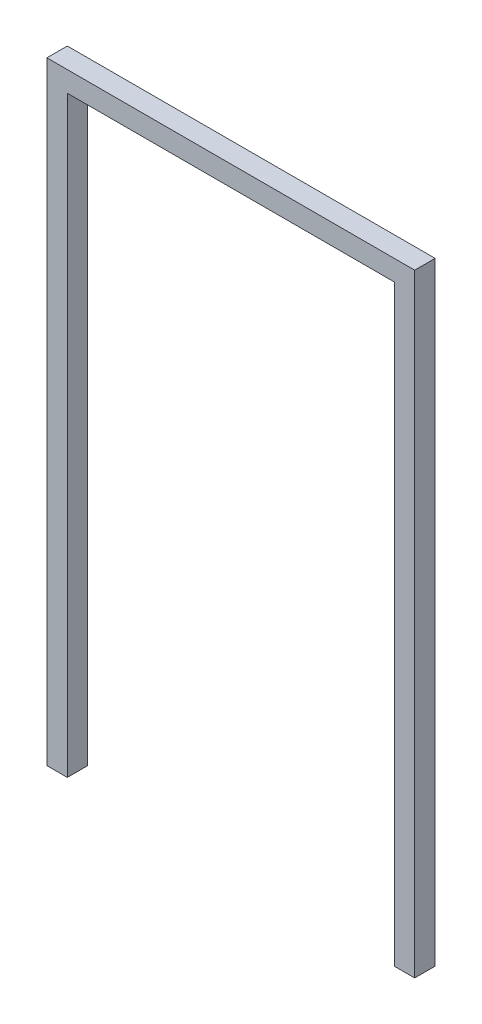
ISO-10303-21;
HEADER;
FILE_DESCRIPTION(('STEP AP214'),'2;1');
FILE_NAME('part.step','',(''),(''),'','','');
FILE_SCHEMA(('AUTOMOTIVE_DESIGN { 1 0 10303 214 1 1 1 1 }'));
ENDSEC;
DATA;
#1=APPLICATION_CONTEXT('core data for automotive mechanical design processes');
#2=APPLICATION_PROTOCOL_DEFINITION('international standard','automotive_design',2000,#1);
#3=PRODUCT_CONTEXT('',#1,'mechanical');
#4=PRODUCT('Part','Part','',(#3));
#5=PRODUCT_RELATED_PRODUCT_CATEGORY('part','',(#4));
#6=PRODUCT_DEFINITION_FORMATION('','',#4);
#7=PRODUCT_DEFINITION_CONTEXT('part definition',#1,'design');
#8=PRODUCT_DEFINITION('design','',#6,#7);
#9=PRODUCT_DEFINITION_SHAPE('','',#8);
#10=(LENGTH_UNIT() NAMED_UNIT(*) SI_UNIT(.MILLI.,.METRE.));
#11=(NAMED_UNIT(*) PLANE_ANGLE_UNIT() SI_UNIT($,.RADIAN.));
#12=(NAMED_UNIT(*) SI_UNIT($,.STERADIAN.) SOLID_ANGLE_UNIT());
#13=UNCERTAINTY_MEASURE_WITH_UNIT(LENGTH_MEASURE(1.E-05),#10,'distance_accuracy_value','');
#14=(GEOMETRIC_REPRESENTATION_CONTEXT(3) GLOBAL_UNCERTAINTY_ASSIGNED_CONTEXT((#13)) GLOBAL_UNIT_ASSIGNED_CONTEXT((#10,
#11,#12)) REPRESENTATION_CONTEXT('',''));
#15=CARTESIAN_POINT('',(0.,0.,0.));
#16=DIRECTION('',(0.,0.,1.));
#17=DIRECTION('',(1.,0.,0.));
#18=AXIS2_PLACEMENT_3D('',#15,#16,#17);
#19=CARTESIAN_POINT('',(-180.,340.,-10.));
#20=DIRECTION('',(-1.,0.,0.));
#21=DIRECTION('',(0.,-1.,0.));
#22=AXIS2_PLACEMENT_3D('',#19,#20,#21);
#23=PLANE('',#22);
#24=DIRECTION('',(0.,-1.,0.));
#25=VECTOR('',#24,1.);
#26=CARTESIAN_POINT('',(-180.,340.,10.));
#27=LINE('',#26,#25);
#28=CARTESIAN_POINT('',(-180.,340.,10.));
#29=VERTEX_POINT('',#28);
#30=CARTESIAN_POINT('',(-180.,-260.,10.));
#31=VERTEX_POINT('',#30);
#32=EDGE_CURVE('E130',#29,#31,#27,.T.);
#33=ORIENTED_EDGE('',*,*,#32,.F.);
#34=DIRECTION('',(0.,0.,1.));
#35=VECTOR('',#34,1.);
#36=CARTESIAN_POINT('',(-180.,340.,-10.));
#37=LINE('',#36,#35);
#38=CARTESIAN_POINT('',(-180.,340.,-10.));
#39=VERTEX_POINT('',#38);
#40=EDGE_CURVE('E11',#39,#29,#37,.T.);
#41=ORIENTED_EDGE('',*,*,#40,.F.);
#42=DIRECTION('',(0.,-1.,0.));
#43=VECTOR('',#42,1.);
#44=CARTESIAN_POINT('',(-180.,340.,-10.));
#45=LINE('',#44,#43);
#46=CARTESIAN_POINT('',(-180.,-260.,-10.));
#47=VERTEX_POINT('',#46);
#48=EDGE_CURVE('E150',#39,#47,#45,.T.);
#49=ORIENTED_EDGE('',*,*,#48,.T.);
#50=DIRECTION('',(0.,0.,1.));
#51=VECTOR('',#50,1.);
#52=CARTESIAN_POINT('',(-180.,-260.,-10.));
#53=LINE('',#52,#51);
#54=EDGE_CURVE('E36',#47,#31,#53,.T.);
#55=ORIENTED_EDGE('',*,*,#54,.T.);
#56=EDGE_LOOP('',(#33,#41,#49,#55));
#57=FACE_BOUND('',#56,.T.);
#58=ADVANCED_FACE('F33',(#57),#23,.T.);
#59=CARTESIAN_POINT('',(-180.,340.,-10.));
#60=DIRECTION('',(0.,1.,0.));
#61=DIRECTION('',(0.,0.,1.));
#62=AXIS2_PLACEMENT_3D('',#59,#60,#61);
#63=PLANE('',#62);
#64=DIRECTION('',(-1.,0.,0.));
#65=VECTOR('',#64,1.);
#66=CARTESIAN_POINT('',(-180.,340.,10.));
#67=LINE('',#66,#65);
#68=CARTESIAN_POINT('',(180.,340.,10.));
#69=VERTEX_POINT('',#68);
#70=EDGE_CURVE('E148',#69,#29,#67,.T.);
#71=ORIENTED_EDGE('',*,*,#70,.F.);
#72=DIRECTION('',(0.,0.,1.));
#73=VECTOR('',#72,1.);
#74=CARTESIAN_POINT('',(180.,340.,-10.));
#75=LINE('',#74,#73);
#76=CARTESIAN_POINT('',(180.,340.,-10.));
#77=VERTEX_POINT('',#76);
#78=EDGE_CURVE('E42',#77,#69,#75,.T.);
#79=ORIENTED_EDGE('',*,*,#78,.F.);
#80=DIRECTION('',(-1.,0.,0.));
#81=VECTOR('',#80,1.);
#82=CARTESIAN_POINT('',(-180.,340.,-10.));
#83=LINE('',#82,#81);
#84=EDGE_CURVE('E120',#77,#39,#83,.T.);
#85=ORIENTED_EDGE('',*,*,#84,.T.);
#86=ORIENTED_EDGE('',*,*,#40,.T.);
#87=EDGE_LOOP('',(#71,#79,#85,#86));
#88=FACE_BOUND('',#87,.T.);
#89=ADVANCED_FACE('F162',(#88),#63,.T.);
#90=CARTESIAN_POINT('',(180.,340.,-10.));
#91=DIRECTION('',(1.,0.,0.));
#92=DIRECTION('',(0.,1.,0.));
#93=AXIS2_PLACEMENT_3D('',#90,#91,#92);
#94=PLANE('',#93);
#95=DIRECTION('',(0.,1.,0.));
#96=VECTOR('',#95,1.);
#97=CARTESIAN_POINT('',(180.,340.,10.));
#98=LINE('',#97,#96);
#99=CARTESIAN_POINT('',(180.,-260.,10.));
#100=VERTEX_POINT('',#99);
#101=EDGE_CURVE('E107',#100,#69,#98,.T.);
#102=ORIENTED_EDGE('',*,*,#101,.F.);
#103=DIRECTION('',(0.,0.,1.));
#104=VECTOR('',#103,1.);
#105=CARTESIAN_POINT('',(180.,-260.,-10.));
#106=LINE('',#105,#104);
#107=CARTESIAN_POINT('',(180.,-260.,-10.));
#108=VERTEX_POINT('',#107);
#109=EDGE_CURVE('E102',#108,#100,#106,.T.);
#110=ORIENTED_EDGE('',*,*,#109,.F.);
#111=DIRECTION('',(0.,1.,0.));
#112=VECTOR('',#111,1.);
#113=CARTESIAN_POINT('',(180.,340.,-10.));
#114=LINE('',#113,#112);
#115=EDGE_CURVE('E105',#108,#77,#114,.T.);
#116=ORIENTED_EDGE('',*,*,#115,.T.);
#117=ORIENTED_EDGE('',*,*,#78,.T.);
#118=EDGE_LOOP('',(#102,#110,#116,#117));
#119=FACE_BOUND('',#118,.T.);
#120=ADVANCED_FACE('F104',(#119),#94,.T.);
#121=CARTESIAN_POINT('',(160.,-260.,-10.));
#122=DIRECTION('',(0.,-1.,0.));
#123=DIRECTION('',(1.,0.,0.));
#124=AXIS2_PLACEMENT_3D('',#121,#122,#123);
#125=PLANE('',#124);
#126=DIRECTION('',(1.,0.,0.));
#127=VECTOR('',#126,1.);
#128=CARTESIAN_POINT('',(160.,-260.,10.));
#129=LINE('',#128,#127);
#130=CARTESIAN_POINT('',(160.,-260.,10.));
#131=VERTEX_POINT('',#130);
#132=EDGE_CURVE('E145',#131,#100,#129,.T.);
#133=ORIENTED_EDGE('',*,*,#132,.F.);
#134=DIRECTION('',(0.,0.,1.));
#135=VECTOR('',#134,1.);
#136=CARTESIAN_POINT('',(160.,-260.,-10.));
#137=LINE('',#136,#135);
#138=CARTESIAN_POINT('',(160.,-260.,-10.));
#139=VERTEX_POINT('',#138);
#140=EDGE_CURVE('E112',#139,#131,#137,.T.);
#141=ORIENTED_EDGE('',*,*,#140,.F.);
#142=DIRECTION('',(1.,0.,0.));
#143=VECTOR('',#142,1.);
#144=CARTESIAN_POINT('',(160.,-260.,-10.));
#145=LINE('',#144,#143);
#146=EDGE_CURVE('E118',#139,#108,#145,.T.);
#147=ORIENTED_EDGE('',*,*,#146,.T.);
#148=ORIENTED_EDGE('',*,*,#109,.T.);
#149=EDGE_LOOP('',(#133,#141,#147,#148));
#150=FACE_BOUND('',#149,.T.);
#151=ADVANCED_FACE('F122',(#150),#125,.T.);
#152=CARTESIAN_POINT('',(160.,320.,-10.));
#153=DIRECTION('',(-1.,0.,0.));
#154=DIRECTION('',(0.,-1.,0.));
#155=AXIS2_PLACEMENT_3D('',#152,#153,#154);
#156=PLANE('',#155);
#157=DIRECTION('',(0.,-1.,0.));
#158=VECTOR('',#157,1.);
#159=CARTESIAN_POINT('',(160.,320.,10.));
#160=LINE('',#159,#158);
#161=CARTESIAN_POINT('',(160.,320.,10.));
#162=VERTEX_POINT('',#161);
#163=EDGE_CURVE('E142',#162,#131,#160,.T.);
#164=ORIENTED_EDGE('',*,*,#163,.F.);
#165=DIRECTION('',(0.,0.,1.));
#166=VECTOR('',#165,1.);
#167=CARTESIAN_POINT('',(160.,320.,-10.));
#168=LINE('',#167,#166);
#169=CARTESIAN_POINT('',(160.,320.,-10.));
#170=VERTEX_POINT('',#169);
#171=EDGE_CURVE('E154',#170,#162,#168,.T.);
#172=ORIENTED_EDGE('',*,*,#171,.F.);
#173=DIRECTION('',(0.,-1.,0.));
#174=VECTOR('',#173,1.);
#175=CARTESIAN_POINT('',(160.,320.,-10.));
#176=LINE('',#175,#174);
#177=EDGE_CURVE('E123',#170,#139,#176,.T.);
#178=ORIENTED_EDGE('',*,*,#177,.T.);
#179=ORIENTED_EDGE('',*,*,#140,.T.);
#180=EDGE_LOOP('',(#164,#172,#178,#179));
#181=FACE_BOUND('',#180,.T.);
#182=ADVANCED_FACE('F175',(#181),#156,.T.);
#183=CARTESIAN_POINT('',(-160.,320.,-10.));
#184=DIRECTION('',(0.,-1.,0.));
#185=DIRECTION('',(1.,0.,0.));
#186=AXIS2_PLACEMENT_3D('',#183,#184,#185);
#187=PLANE('',#186);
#188=DIRECTION('',(1.,0.,0.));
#189=VECTOR('',#188,1.);
#190=CARTESIAN_POINT('',(-160.,320.,10.));
#191=LINE('',#190,#189);
#192=CARTESIAN_POINT('',(-160.,320.,10.));
#193=VERTEX_POINT('',#192);
#194=EDGE_CURVE('E139',#193,#162,#191,.T.);
#195=ORIENTED_EDGE('',*,*,#194,.F.);
#196=DIRECTION('',(0.,0.,1.));
#197=VECTOR('',#196,1.);
#198=CARTESIAN_POINT('',(-160.,320.,-10.));
#199=LINE('',#198,#197);
#200=CARTESIAN_POINT('',(-160.,320.,-10.));
#201=VERTEX_POINT('',#200);
#202=EDGE_CURVE('E156',#201,#193,#199,.T.);
#203=ORIENTED_EDGE('',*,*,#202,.F.);
#204=DIRECTION('',(1.,0.,0.));
#205=VECTOR('',#204,1.);
#206=CARTESIAN_POINT('',(-160.,320.,-10.));
#207=LINE('',#206,#205);
#208=EDGE_CURVE('E125',#201,#170,#207,.T.);
#209=ORIENTED_EDGE('',*,*,#208,.T.);
#210=ORIENTED_EDGE('',*,*,#171,.T.);
#211=EDGE_LOOP('',(#195,#203,#209,#210));
#212=FACE_BOUND('',#211,.T.);
#213=ADVANCED_FACE('F178',(#212),#187,.T.);
#214=CARTESIAN_POINT('',(-160.,320.,-10.));
#215=DIRECTION('',(1.,0.,0.));
#216=DIRECTION('',(0.,1.,0.));
#217=AXIS2_PLACEMENT_3D('',#214,#215,#216);
#218=PLANE('',#217);
#219=DIRECTION('',(0.,1.,0.));
#220=VECTOR('',#219,1.);
#221=CARTESIAN_POINT('',(-160.,320.,10.));
#222=LINE('',#221,#220);
#223=CARTESIAN_POINT('',(-160.,-260.,10.));
#224=VERTEX_POINT('',#223);
#225=EDGE_CURVE('E136',#224,#193,#222,.T.);
#226=ORIENTED_EDGE('',*,*,#225,.F.);
#227=DIRECTION('',(0.,0.,1.));
#228=VECTOR('',#227,1.);
#229=CARTESIAN_POINT('',(-160.,-260.,-10.));
#230=LINE('',#229,#228);
#231=CARTESIAN_POINT('',(-160.,-260.,-10.));
#232=VERTEX_POINT('',#231);
#233=EDGE_CURVE('E157',#232,#224,#230,.T.);
#234=ORIENTED_EDGE('',*,*,#233,.F.);
#235=DIRECTION('',(0.,1.,0.));
#236=VECTOR('',#235,1.);
#237=CARTESIAN_POINT('',(-160.,320.,-10.));
#238=LINE('',#237,#236);
#239=EDGE_CURVE('E259',#232,#201,#238,.T.);
#240=ORIENTED_EDGE('',*,*,#239,.T.);
#241=ORIENTED_EDGE('',*,*,#202,.T.);
#242=EDGE_LOOP('',(#226,#234,#240,#241));
#243=FACE_BOUND('',#242,.T.);
#244=ADVANCED_FACE('F182',(#243),#218,.T.);
#245=CARTESIAN_POINT('',(-180.,-260.,-10.));
#246=DIRECTION('',(0.,-1.,0.));
#247=DIRECTION('',(0.,0.,-1.));
#248=AXIS2_PLACEMENT_3D('',#245,#246,#247);
#249=PLANE('',#248);
#250=DIRECTION('',(1.,0.,0.));
#251=VECTOR('',#250,1.);
#252=CARTESIAN_POINT('',(-180.,-260.,10.));
#253=LINE('',#252,#251);
#254=EDGE_CURVE('E133',#31,#224,#253,.T.);
#255=ORIENTED_EDGE('',*,*,#254,.F.);
#256=ORIENTED_EDGE('',*,*,#54,.F.);
#257=DIRECTION('',(1.,0.,0.));
#258=VECTOR('',#257,1.);
#259=CARTESIAN_POINT('',(-180.,-260.,-10.));
#260=LINE('',#259,#258);
#261=EDGE_CURVE('E260',#47,#232,#260,.T.);
#262=ORIENTED_EDGE('',*,*,#261,.T.);
#263=ORIENTED_EDGE('',*,*,#233,.T.);
#264=EDGE_LOOP('',(#255,#256,#262,#263));
#265=FACE_BOUND('',#264,.T.);
#266=ADVANCED_FACE('F159',(#265),#249,.T.);
#267=CARTESIAN_POINT('',(0.,0.,-10.));
#268=DIRECTION('',(0.,0.,1.));
#269=DIRECTION('',(1.,0.,0.));
#270=AXIS2_PLACEMENT_3D('',#267,#268,#269);
#271=PLANE('',#270);
#272=ORIENTED_EDGE('',*,*,#48,.F.);
#273=ORIENTED_EDGE('',*,*,#84,.F.);
#274=ORIENTED_EDGE('',*,*,#115,.F.);
#275=ORIENTED_EDGE('',*,*,#146,.F.);
#276=ORIENTED_EDGE('',*,*,#177,.F.);
#277=ORIENTED_EDGE('',*,*,#208,.F.);
#278=ORIENTED_EDGE('',*,*,#239,.F.);
#279=ORIENTED_EDGE('',*,*,#261,.F.);
#280=EDGE_LOOP('',(#272,#273,#274,#275,#276,#277,#278,#279));
#281=FACE_BOUND('',#280,.T.);
#282=ADVANCED_FACE('F116',(#281),#271,.F.);
#283=CARTESIAN_POINT('',(0.,0.,10.));
#284=DIRECTION('',(0.,0.,1.));
#285=DIRECTION('',(1.,0.,0.));
#286=AXIS2_PLACEMENT_3D('',#283,#284,#285);
#287=PLANE('',#286);
#288=ORIENTED_EDGE('',*,*,#32,.T.);
#289=ORIENTED_EDGE('',*,*,#254,.T.);
#290=ORIENTED_EDGE('',*,*,#225,.T.);
#291=ORIENTED_EDGE('',*,*,#194,.T.);
#292=ORIENTED_EDGE('',*,*,#163,.T.);
#293=ORIENTED_EDGE('',*,*,#132,.T.);
#294=ORIENTED_EDGE('',*,*,#101,.T.);
#295=ORIENTED_EDGE('',*,*,#70,.T.);
#296=EDGE_LOOP('',(#288,#289,#290,#291,#292,#293,#294,#295));
#297=FACE_BOUND('',#296,.T.);
#298=ADVANCED_FACE('F161',(#297),#287,.T.);
#299=CLOSED_SHELL('',(#58,#89,#120,#151,#182,#213,#244,#266,#282,#298));
#300=MANIFOLD_SOLID_BREP('B2',#299);
#301=ADVANCED_BREP_SHAPE_REPRESENTATION('',(#18,#300),#14);
#302=SHAPE_DEFINITION_REPRESENTATION(#9,#301);
ENDSEC;
END-ISO-10303-21;
